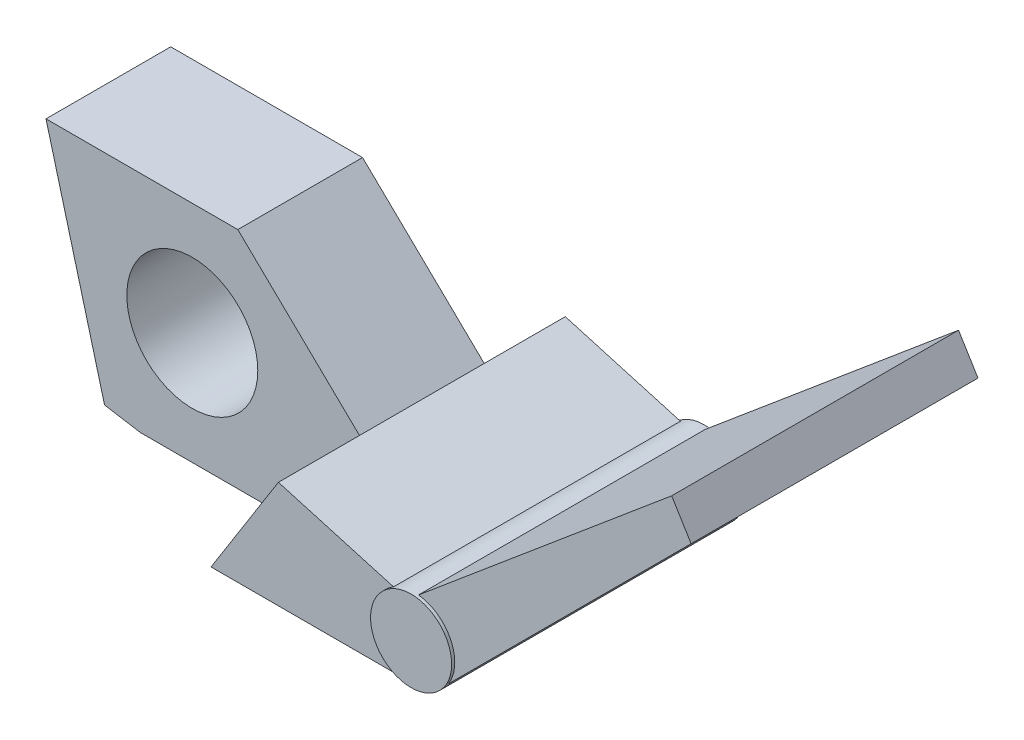
ISO-10303-21;
HEADER;
FILE_DESCRIPTION(('STEP AP214'),'2;1');
FILE_NAME('part.step','',(''),(''),'','','');
FILE_SCHEMA(('AUTOMOTIVE_DESIGN { 1 0 10303 214 1 1 1 1 }'));
ENDSEC;
DATA;
#1=APPLICATION_CONTEXT('core data for automotive mechanical design processes');
#2=APPLICATION_PROTOCOL_DEFINITION('international standard','automotive_design',2000,#1);
#3=PRODUCT_CONTEXT('',#1,'mechanical');
#4=PRODUCT('Part','Part','',(#3));
#5=PRODUCT_RELATED_PRODUCT_CATEGORY('part','',(#4));
#6=PRODUCT_DEFINITION_FORMATION('','',#4);
#7=PRODUCT_DEFINITION_CONTEXT('part definition',#1,'design');
#8=PRODUCT_DEFINITION('design','',#6,#7);
#9=PRODUCT_DEFINITION_SHAPE('','',#8);
#10=(LENGTH_UNIT() NAMED_UNIT(*) SI_UNIT(.MILLI.,.METRE.));
#11=(NAMED_UNIT(*) PLANE_ANGLE_UNIT() SI_UNIT($,.RADIAN.));
#12=(NAMED_UNIT(*) SI_UNIT($,.STERADIAN.) SOLID_ANGLE_UNIT());
#13=UNCERTAINTY_MEASURE_WITH_UNIT(LENGTH_MEASURE(1.E-05),#10,'distance_accuracy_value','');
#14=(GEOMETRIC_REPRESENTATION_CONTEXT(3) GLOBAL_UNCERTAINTY_ASSIGNED_CONTEXT((#13)) GLOBAL_UNIT_ASSIGNED_CONTEXT((#10,
#11,#12)) REPRESENTATION_CONTEXT('',''));
#15=CARTESIAN_POINT('',(0.,0.,0.));
#16=DIRECTION('',(0.,0.,1.));
#17=DIRECTION('',(1.,0.,0.));
#18=AXIS2_PLACEMENT_3D('',#15,#16,#17);
#19=CARTESIAN_POINT('',(0.,9.,5.));
#20=DIRECTION('',(0.,1.,0.));
#21=DIRECTION('',(0.,0.,1.));
#22=AXIS2_PLACEMENT_3D('',#19,#20,#21);
#23=PLANE('',#22);
#24=DIRECTION('',(1.,0.,0.));
#25=VECTOR('',#24,1.);
#26=CARTESIAN_POINT('',(0.,9.,-5.));
#27=LINE('',#26,#25);
#28=CARTESIAN_POINT('',(-11.7290283555708,9.,-5.));
#29=VERTEX_POINT('',#28);
#30=CARTESIAN_POINT('',(3.65,9.,-5.));
#31=VERTEX_POINT('',#30);
#32=EDGE_CURVE('E251',#29,#31,#27,.T.);
#33=ORIENTED_EDGE('',*,*,#32,.F.);
#34=DIRECTION('',(0.,0.,-1.));
#35=VECTOR('',#34,1.);
#36=CARTESIAN_POINT('',(-11.7290283555708,9.,5.));
#37=LINE('',#36,#35);
#38=CARTESIAN_POINT('',(-11.7290283555708,9.,5.));
#39=VERTEX_POINT('',#38);
#40=EDGE_CURVE('E144',#39,#29,#37,.T.);
#41=ORIENTED_EDGE('',*,*,#40,.F.);
#42=DIRECTION('',(1.,0.,0.));
#43=VECTOR('',#42,1.);
#44=CARTESIAN_POINT('',(0.,9.,5.));
#45=LINE('',#44,#43);
#46=CARTESIAN_POINT('',(3.65,9.,5.));
#47=VERTEX_POINT('',#46);
#48=EDGE_CURVE('E153',#39,#47,#45,.T.);
#49=ORIENTED_EDGE('',*,*,#48,.T.);
#50=DIRECTION('',(0.,0.,-1.));
#51=VECTOR('',#50,1.);
#52=CARTESIAN_POINT('',(3.65,9.,5.));
#53=LINE('',#52,#51);
#54=EDGE_CURVE('E42',#47,#31,#53,.T.);
#55=ORIENTED_EDGE('',*,*,#54,.T.);
#56=EDGE_LOOP('',(#33,#41,#49,#55));
#57=FACE_BOUND('',#56,.T.);
#58=ADVANCED_FACE('F34',(#57),#23,.T.);
#59=CARTESIAN_POINT('',(0.,-9.,5.));
#60=DIRECTION('',(0.,1.,0.));
#61=DIRECTION('',(0.,0.,1.));
#62=AXIS2_PLACEMENT_3D('',#59,#60,#61);
#63=PLANE('',#62);
#64=DIRECTION('',(1.,0.,0.));
#65=VECTOR('',#64,1.);
#66=CARTESIAN_POINT('',(0.,-9.,5.));
#67=LINE('',#66,#65);
#68=CARTESIAN_POINT('',(-4.17691453623992,-9.,5.));
#69=VERTEX_POINT('',#68);
#70=CARTESIAN_POINT('',(8.,-9.,5.));
#71=VERTEX_POINT('',#70);
#72=EDGE_CURVE('E241',#69,#71,#67,.T.);
#73=ORIENTED_EDGE('',*,*,#72,.F.);
#74=DIRECTION('',(0.,0.,-1.));
#75=VECTOR('',#74,1.);
#76=CARTESIAN_POINT('',(-4.17691453623992,-9.,5.));
#77=LINE('',#76,#75);
#78=CARTESIAN_POINT('',(-4.17691453623992,-9.,-5.));
#79=VERTEX_POINT('',#78);
#80=EDGE_CURVE('E159',#69,#79,#77,.T.);
#81=ORIENTED_EDGE('',*,*,#80,.T.);
#82=DIRECTION('',(1.,0.,0.));
#83=VECTOR('',#82,1.);
#84=CARTESIAN_POINT('',(0.,-9.,-5.));
#85=LINE('',#84,#83);
#86=CARTESIAN_POINT('',(8.,-9.,-5.));
#87=VERTEX_POINT('',#86);
#88=EDGE_CURVE('E254',#79,#87,#85,.T.);
#89=ORIENTED_EDGE('',*,*,#88,.T.);
#90=DIRECTION('',(0.,0.,-1.));
#91=VECTOR('',#90,1.);
#92=CARTESIAN_POINT('',(8.,-9.,11.5));
#93=LINE('',#92,#91);
#94=CARTESIAN_POINT('',(8.,-9.,-11.5));
#95=VERTEX_POINT('',#94);
#96=EDGE_CURVE('E224',#87,#95,#93,.T.);
#97=ORIENTED_EDGE('',*,*,#96,.T.);
#98=DIRECTION('',(1.,0.,0.));
#99=VECTOR('',#98,1.);
#100=CARTESIAN_POINT('',(0.,-9.,-11.5));
#101=LINE('',#100,#99);
#102=CARTESIAN_POINT('',(23.45,-9.,-11.5));
#103=VERTEX_POINT('',#102);
#104=EDGE_CURVE('E204',#95,#103,#101,.T.);
#105=ORIENTED_EDGE('',*,*,#104,.T.);
#106=DIRECTION('',(0.,0.,-1.));
#107=VECTOR('',#106,1.);
#108=CARTESIAN_POINT('',(23.45,-9.,11.5));
#109=LINE('',#108,#107);
#110=CARTESIAN_POINT('',(23.45,-9.,11.5));
#111=VERTEX_POINT('',#110);
#112=EDGE_CURVE('E212',#111,#103,#109,.T.);
#113=ORIENTED_EDGE('',*,*,#112,.F.);
#114=DIRECTION('',(1.,0.,0.));
#115=VECTOR('',#114,1.);
#116=CARTESIAN_POINT('',(0.,-9.,11.5));
#117=LINE('',#116,#115);
#118=CARTESIAN_POINT('',(8.,-9.,11.5));
#119=VERTEX_POINT('',#118);
#120=EDGE_CURVE('E209',#119,#111,#117,.T.);
#121=ORIENTED_EDGE('',*,*,#120,.F.);
#122=EDGE_CURVE('E225',#119,#71,#93,.T.);
#123=ORIENTED_EDGE('',*,*,#122,.T.);
#124=EDGE_LOOP('',(#73,#81,#89,#97,#105,#113,#121,#123));
#125=FACE_BOUND('',#124,.T.);
#126=ADVANCED_FACE('F290',(#125),#63,.F.);
#127=CARTESIAN_POINT('',(0.,0.,5.));
#128=DIRECTION('',(0.,0.,-1.));
#129=DIRECTION('',(-1.,0.,0.));
#130=AXIS2_PLACEMENT_3D('',#127,#128,#129);
#131=CYLINDRICAL_SURFACE('',#130,5.25);
#132=CARTESIAN_POINT('',(0.,0.,5.));
#133=DIRECTION('',(0.,0.,1.));
#134=DIRECTION('',(1.,0.,0.));
#135=AXIS2_PLACEMENT_3D('',#132,#133,#134);
#136=CIRCLE('',#135,5.25);
#137=CARTESIAN_POINT('',(5.25,0.,5.));
#138=VERTEX_POINT('',#137);
#139=EDGE_CURVE('E236',#138,#138,#136,.T.);
#140=ORIENTED_EDGE('',*,*,#139,.T.);
#141=EDGE_LOOP('',(#140));
#142=FACE_BOUND('',#141,.T.);
#143=CARTESIAN_POINT('',(0.,0.,-5.));
#144=DIRECTION('',(0.,0.,1.));
#145=DIRECTION('',(1.,0.,0.));
#146=AXIS2_PLACEMENT_3D('',#143,#144,#145);
#147=CIRCLE('',#146,5.25);
#148=CARTESIAN_POINT('',(5.25,0.,-5.));
#149=VERTEX_POINT('',#148);
#150=EDGE_CURVE('E235',#149,#149,#147,.T.);
#151=ORIENTED_EDGE('',*,*,#150,.F.);
#152=EDGE_LOOP('',(#151));
#153=FACE_BOUND('',#152,.T.);
#154=ADVANCED_FACE('F36',(#142,#153),#131,.F.);
#155=CARTESIAN_POINT('',(6.25856714010387,6.48093599447109,5.));
#156=DIRECTION('',(0.694658370458998,0.71933980033865,0.));
#157=DIRECTION('',(-0.71933980033865,0.694658370458998,0.));
#158=AXIS2_PLACEMENT_3D('',#155,#156,#157);
#159=PLANE('',#158);
#160=DIRECTION('',(0.71933980033865,-0.694658370458998,0.));
#161=VECTOR('',#160,1.);
#162=CARTESIAN_POINT('',(6.25856714010387,6.48093599447109,-5.));
#163=LINE('',#162,#161);
#164=CARTESIAN_POINT('',(13.4042476925921,-0.419567503424018,-5.));
#165=VERTEX_POINT('',#164);
#166=EDGE_CURVE('E239',#31,#165,#163,.T.);
#167=ORIENTED_EDGE('',*,*,#166,.F.);
#168=ORIENTED_EDGE('',*,*,#54,.F.);
#169=DIRECTION('',(0.71933980033865,-0.694658370458998,0.));
#170=VECTOR('',#169,1.);
#171=CARTESIAN_POINT('',(6.25856714010387,6.48093599447109,5.));
#172=LINE('',#171,#170);
#173=CARTESIAN_POINT('',(13.4042476925921,-0.419567503424018,5.));
#174=VERTEX_POINT('',#173);
#175=EDGE_CURVE('E246',#47,#174,#172,.T.);
#176=ORIENTED_EDGE('',*,*,#175,.T.);
#177=DIRECTION('',(0.,0.,-1.));
#178=VECTOR('',#177,1.);
#179=CARTESIAN_POINT('',(13.4042476925921,-0.419567503424018,5.));
#180=LINE('',#179,#178);
#181=EDGE_CURVE('E11',#174,#165,#180,.T.);
#182=ORIENTED_EDGE('',*,*,#181,.T.);
#183=EDGE_LOOP('',(#167,#168,#176,#182));
#184=FACE_BOUND('',#183,.T.);
#185=ADVANCED_FACE('F266',(#184),#159,.T.);
#186=CARTESIAN_POINT('',(0.,0.,5.));
#187=DIRECTION('',(0.,0.,1.));
#188=DIRECTION('',(1.,0.,0.));
#189=AXIS2_PLACEMENT_3D('',#186,#187,#188);
#190=PLANE('',#189);
#191=ORIENTED_EDGE('',*,*,#48,.F.);
#192=DIRECTION('',(-0.258819045102514,0.96592582628907,0.));
#193=VECTOR('',#192,1.);
#194=CARTESIAN_POINT('',(-11.7290283555708,9.,5.));
#195=LINE('',#194,#193);
#196=CARTESIAN_POINT('',(-7.03385588152449,-8.52262222344006,5.));
#197=VERTEX_POINT('',#196);
#198=EDGE_CURVE('E137',#197,#39,#195,.T.);
#199=ORIENTED_EDGE('',*,*,#198,.F.);
#200=DIRECTION('',(-0.986325487801991,0.164809077760192,0.));
#201=VECTOR('',#200,1.);
#202=CARTESIAN_POINT('',(-7.03385588152449,-8.52262222344006,5.));
#203=LINE('',#202,#201);
#204=EDGE_CURVE('E150',#69,#197,#203,.T.);
#205=ORIENTED_EDGE('',*,*,#204,.F.);
#206=ORIENTED_EDGE('',*,*,#72,.T.);
#207=DIRECTION('',(-0.532937069906378,-0.846154879156059,0.));
#208=VECTOR('',#207,1.);
#209=CARTESIAN_POINT('',(9.78635035401657,-6.16377570019889,5.));
#210=LINE('',#209,#208);
#211=EDGE_CURVE('E243',#174,#71,#210,.T.);
#212=ORIENTED_EDGE('',*,*,#211,.F.);
#213=ORIENTED_EDGE('',*,*,#175,.F.);
#214=EDGE_LOOP('',(#191,#199,#205,#206,#212,#213));
#215=FACE_BOUND('',#214,.T.);
#216=ORIENTED_EDGE('',*,*,#139,.F.);
#217=EDGE_LOOP('',(#216));
#218=FACE_BOUND('',#217,.T.);
#219=ADVANCED_FACE('F148',(#215,#218),#190,.T.);
#220=CARTESIAN_POINT('',(0.,0.,-5.));
#221=DIRECTION('',(0.,0.,1.));
#222=DIRECTION('',(1.,0.,0.));
#223=AXIS2_PLACEMENT_3D('',#220,#221,#222);
#224=PLANE('',#223);
#225=ORIENTED_EDGE('',*,*,#150,.T.);
#226=EDGE_LOOP('',(#225));
#227=FACE_BOUND('',#226,.T.);
#228=ORIENTED_EDGE('',*,*,#88,.F.);
#229=DIRECTION('',(-0.986325487801991,0.164809077760192,0.));
#230=VECTOR('',#229,1.);
#231=CARTESIAN_POINT('',(-7.03385588152449,-8.52262222344006,-5.));
#232=LINE('',#231,#230);
#233=CARTESIAN_POINT('',(-7.03385588152449,-8.52262222344006,-5.));
#234=VERTEX_POINT('',#233);
#235=EDGE_CURVE('E161',#79,#234,#232,.T.);
#236=ORIENTED_EDGE('',*,*,#235,.T.);
#237=DIRECTION('',(-0.258819045102514,0.96592582628907,0.));
#238=VECTOR('',#237,1.);
#239=CARTESIAN_POINT('',(-11.7290283555708,9.,-5.));
#240=LINE('',#239,#238);
#241=EDGE_CURVE('E139',#234,#29,#240,.T.);
#242=ORIENTED_EDGE('',*,*,#241,.T.);
#243=ORIENTED_EDGE('',*,*,#32,.T.);
#244=ORIENTED_EDGE('',*,*,#166,.T.);
#245=DIRECTION('',(-0.532937069906378,-0.846154879156059,0.));
#246=VECTOR('',#245,1.);
#247=CARTESIAN_POINT('',(9.78635035401657,-6.16377570019889,-5.));
#248=LINE('',#247,#246);
#249=EDGE_CURVE('E256',#165,#87,#248,.T.);
#250=ORIENTED_EDGE('',*,*,#249,.T.);
#251=EDGE_LOOP('',(#228,#236,#242,#243,#244,#250));
#252=FACE_BOUND('',#251,.T.);
#253=ADVANCED_FACE('F264',(#227,#252),#224,.F.);
#254=CARTESIAN_POINT('',(9.78635035401657,-6.16377570019889,11.5));
#255=DIRECTION('',(0.846154879156059,-0.532937069906378,0.));
#256=DIRECTION('',(0.532937069906378,0.846154879156059,0.));
#257=AXIS2_PLACEMENT_3D('',#254,#255,#256);
#258=PLANE('',#257);
#259=DIRECTION('',(0.,0.,-1.));
#260=VECTOR('',#259,1.);
#261=CARTESIAN_POINT('',(13.4042476925921,-0.419567503424018,11.5));
#262=LINE('',#261,#260);
#263=CARTESIAN_POINT('',(13.4042476925921,-0.419567503424018,11.5));
#264=VERTEX_POINT('',#263);
#265=EDGE_CURVE('E229',#264,#174,#262,.T.);
#266=ORIENTED_EDGE('',*,*,#265,.T.);
#267=ORIENTED_EDGE('',*,*,#211,.T.);
#268=ORIENTED_EDGE('',*,*,#122,.F.);
#269=DIRECTION('',(-0.532937069906378,-0.846154879156059,0.));
#270=VECTOR('',#269,1.);
#271=CARTESIAN_POINT('',(9.78635035401657,-6.16377570019889,11.5));
#272=LINE('',#271,#270);
#273=EDGE_CURVE('E207',#264,#119,#272,.T.);
#274=ORIENTED_EDGE('',*,*,#273,.F.);
#275=EDGE_LOOP('',(#266,#267,#268,#274));
#276=FACE_BOUND('',#275,.T.);
#277=ADVANCED_FACE('F274',(#276),#258,.F.);
#278=CARTESIAN_POINT('',(0.907232026884793,3.16389407447309,11.5));
#279=DIRECTION('',(0.275637355816999,0.961261695938319,0.));
#280=DIRECTION('',(-0.961261695938319,0.275637355816999,0.));
#281=AXIS2_PLACEMENT_3D('',#278,#279,#280);
#282=PLANE('',#281);
#283=DIRECTION('',(0.961261695938319,-0.275637355816999,0.));
#284=VECTOR('',#283,1.);
#285=CARTESIAN_POINT('',(0.907232026884793,3.16389407447309,-11.5));
#286=LINE('',#285,#284);
#287=CARTESIAN_POINT('',(13.4042476925921,-0.419567503424018,-11.5));
#288=VERTEX_POINT('',#287);
#289=CARTESIAN_POINT('',(22.6342476925921,-3.06622741397782,-11.5));
#290=VERTEX_POINT('',#289);
#291=EDGE_CURVE('E215',#288,#290,#286,.T.);
#292=ORIENTED_EDGE('',*,*,#291,.F.);
#293=EDGE_CURVE('E228',#165,#288,#262,.T.);
#294=ORIENTED_EDGE('',*,*,#293,.F.);
#295=ORIENTED_EDGE('',*,*,#181,.F.);
#296=ORIENTED_EDGE('',*,*,#265,.F.);
#297=DIRECTION('',(0.961261695938319,-0.275637355816999,0.));
#298=VECTOR('',#297,1.);
#299=CARTESIAN_POINT('',(0.907232026884793,3.16389407447309,11.5));
#300=LINE('',#299,#298);
#301=CARTESIAN_POINT('',(22.6342476925921,-3.06622741397782,11.5));
#302=VERTEX_POINT('',#301);
#303=EDGE_CURVE('E203',#264,#302,#300,.T.);
#304=ORIENTED_EDGE('',*,*,#303,.T.);
#305=DIRECTION('',(0.,0.,-1.));
#306=VECTOR('',#305,1.);
#307=CARTESIAN_POINT('',(22.6342476925921,-3.06622741397782,11.5));
#308=LINE('',#307,#306);
#309=EDGE_CURVE('E232',#302,#290,#308,.T.);
#310=ORIENTED_EDGE('',*,*,#309,.T.);
#311=EDGE_LOOP('',(#292,#294,#295,#296,#304,#310));
#312=FACE_BOUND('',#311,.T.);
#313=ADVANCED_FACE('F271',(#312),#282,.T.);
#314=ORIENTED_EDGE('',*,*,#249,.F.);
#315=ORIENTED_EDGE('',*,*,#293,.T.);
#316=DIRECTION('',(-0.532937069906378,-0.846154879156059,0.));
#317=VECTOR('',#316,1.);
#318=CARTESIAN_POINT('',(9.78635035401657,-6.16377570019889,-11.5));
#319=LINE('',#318,#317);
#320=EDGE_CURVE('E218',#288,#95,#319,.T.);
#321=ORIENTED_EDGE('',*,*,#320,.T.);
#322=ORIENTED_EDGE('',*,*,#96,.F.);
#323=EDGE_LOOP('',(#314,#315,#321,#322));
#324=FACE_BOUND('',#323,.T.);
#325=ADVANCED_FACE('F288',(#324),#258,.F.);
#326=CARTESIAN_POINT('',(0.,0.,11.5));
#327=DIRECTION('',(0.,0.,1.));
#328=DIRECTION('',(1.,0.,0.));
#329=AXIS2_PLACEMENT_3D('',#326,#327,#328);
#330=PLANE('',#329);
#331=CARTESIAN_POINT('',(24.2927879127426,-5.86117720568125,11.5));
#332=DIRECTION('',(0.,0.,1.));
#333=DIRECTION('',(1.,0.,0.));
#334=AXIS2_PLACEMENT_3D('',#331,#332,#333);
#335=CIRCLE('',#334,3.25);
#336=EDGE_CURVE('E201',#302,#111,#335,.T.);
#337=ORIENTED_EDGE('',*,*,#336,.F.);
#338=ORIENTED_EDGE('',*,*,#303,.F.);
#339=ORIENTED_EDGE('',*,*,#273,.T.);
#340=ORIENTED_EDGE('',*,*,#120,.T.);
#341=EDGE_LOOP('',(#337,#338,#339,#340));
#342=FACE_BOUND('',#341,.T.);
#343=ADVANCED_FACE('F280',(#342),#330,.T.);
#344=CARTESIAN_POINT('',(0.,0.,-11.5));
#345=DIRECTION('',(0.,0.,1.));
#346=DIRECTION('',(1.,0.,0.));
#347=AXIS2_PLACEMENT_3D('',#344,#345,#346);
#348=PLANE('',#347);
#349=CARTESIAN_POINT('',(24.2927879127426,-5.86117720568125,-11.5));
#350=DIRECTION('',(0.,0.,1.));
#351=DIRECTION('',(1.,0.,0.));
#352=AXIS2_PLACEMENT_3D('',#349,#350,#351);
#353=CIRCLE('',#352,3.25);
#354=EDGE_CURVE('E198',#290,#103,#353,.T.);
#355=ORIENTED_EDGE('',*,*,#354,.T.);
#356=ORIENTED_EDGE('',*,*,#104,.F.);
#357=ORIENTED_EDGE('',*,*,#320,.F.);
#358=ORIENTED_EDGE('',*,*,#291,.T.);
#359=EDGE_LOOP('',(#355,#356,#357,#358));
#360=FACE_BOUND('',#359,.T.);
#361=ADVANCED_FACE('F284',(#360),#348,.F.);
#362=CARTESIAN_POINT('',(24.2927879127426,-5.86117720568125,11.75));
#363=DIRECTION('',(0.,0.,-1.));
#364=DIRECTION('',(-1.,0.,0.));
#365=AXIS2_PLACEMENT_3D('',#362,#363,#364);
#366=CYLINDRICAL_SURFACE('',#365,3.25);
#367=DIRECTION('',(0.,0.,-1.));
#368=VECTOR('',#367,1.);
#369=CARTESIAN_POINT('',(27.0470999389281,-7.5863627790067,11.5));
#370=LINE('',#369,#368);
#371=CARTESIAN_POINT('',(27.0470999389281,-7.58636277900669,11.5));
#372=VERTEX_POINT('',#371);
#373=CARTESIAN_POINT('',(27.0470999389281,-7.58636277900671,-11.5));
#374=VERTEX_POINT('',#373);
#375=EDGE_CURVE('E49',#372,#374,#370,.T.);
#376=ORIENTED_EDGE('',*,*,#375,.F.);
#377=CARTESIAN_POINT('',(24.2927879127426,-5.86117720568125,11.5));
#378=DIRECTION('',(0.,0.,1.));
#379=DIRECTION('',(1.,0.,0.));
#380=AXIS2_PLACEMENT_3D('',#377,#378,#379);
#381=CIRCLE('',#380,3.25);
#382=CARTESIAN_POINT('',(24.6324818691016,-2.62897857069404,11.5));
#383=VERTEX_POINT('',#382);
#384=EDGE_CURVE('E54',#372,#383,#381,.T.);
#385=ORIENTED_EDGE('',*,*,#384,.T.);
#386=DIRECTION('',(0.,0.,-1.));
#387=VECTOR('',#386,1.);
#388=CARTESIAN_POINT('',(24.6324818691016,-2.62897857069404,11.5));
#389=LINE('',#388,#387);
#390=CARTESIAN_POINT('',(24.6324818691016,-2.62897857069404,-11.5));
#391=VERTEX_POINT('',#390);
#392=EDGE_CURVE('E177',#383,#391,#389,.T.);
#393=ORIENTED_EDGE('',*,*,#392,.T.);
#394=CARTESIAN_POINT('',(24.2927879127426,-5.86117720568125,-11.5));
#395=DIRECTION('',(0.,0.,1.));
#396=DIRECTION('',(1.,0.,0.));
#397=AXIS2_PLACEMENT_3D('',#394,#395,#396);
#398=CIRCLE('',#397,3.25);
#399=EDGE_CURVE('E167',#374,#391,#398,.T.);
#400=ORIENTED_EDGE('',*,*,#399,.F.);
#401=EDGE_LOOP('',(#376,#385,#393,#400));
#402=FACE_BOUND('',#401,.T.);
#403=ORIENTED_EDGE('',*,*,#336,.T.);
#404=ORIENTED_EDGE('',*,*,#112,.T.);
#405=ORIENTED_EDGE('',*,*,#354,.F.);
#406=ORIENTED_EDGE('',*,*,#309,.F.);
#407=EDGE_LOOP('',(#403,#404,#405,#406));
#408=FACE_BOUND('',#407,.T.);
#409=CARTESIAN_POINT('',(24.2927879127426,-5.86117720568125,11.75));
#410=DIRECTION('',(0.,0.,1.));
#411=DIRECTION('',(1.,0.,0.));
#412=AXIS2_PLACEMENT_3D('',#409,#410,#411);
#413=CIRCLE('',#412,3.25);
#414=CARTESIAN_POINT('',(27.5427879127426,-5.86117720568125,11.75));
#415=VERTEX_POINT('',#414);
#416=EDGE_CURVE('E195',#415,#415,#413,.T.);
#417=ORIENTED_EDGE('',*,*,#416,.F.);
#418=EDGE_LOOP('',(#417));
#419=FACE_BOUND('',#418,.T.);
#420=CARTESIAN_POINT('',(24.2927879127426,-5.86117720568125,-11.75));
#421=DIRECTION('',(0.,0.,1.));
#422=DIRECTION('',(1.,0.,0.));
#423=AXIS2_PLACEMENT_3D('',#420,#421,#422);
#424=CIRCLE('',#423,3.25);
#425=CARTESIAN_POINT('',(27.5427879127426,-5.86117720568125,-11.75));
#426=VERTEX_POINT('',#425);
#427=EDGE_CURVE('E194',#426,#426,#424,.T.);
#428=ORIENTED_EDGE('',*,*,#427,.T.);
#429=EDGE_LOOP('',(#428));
#430=FACE_BOUND('',#429,.T.);
#431=ADVANCED_FACE('F292',(#402,#408,#419,#430),#366,.T.);
#432=CARTESIAN_POINT('',(0.,0.,11.75));
#433=DIRECTION('',(0.,0.,1.));
#434=DIRECTION('',(1.,0.,0.));
#435=AXIS2_PLACEMENT_3D('',#432,#433,#434);
#436=PLANE('',#435);
#437=ORIENTED_EDGE('',*,*,#416,.T.);
#438=EDGE_LOOP('',(#437));
#439=FACE_BOUND('',#438,.T.);
#440=ADVANCED_FACE('F295',(#439),#436,.T.);
#441=CARTESIAN_POINT('',(0.,0.,-11.75));
#442=DIRECTION('',(0.,0.,1.));
#443=DIRECTION('',(1.,0.,0.));
#444=AXIS2_PLACEMENT_3D('',#441,#442,#443);
#445=PLANE('',#444);
#446=ORIENTED_EDGE('',*,*,#427,.F.);
#447=EDGE_LOOP('',(#446));
#448=FACE_BOUND('',#447,.T.);
#449=ADVANCED_FACE('F301',(#448),#445,.F.);
#450=CARTESIAN_POINT('',(17.3167313589674,-17.3167313589674,11.5));
#451=DIRECTION('',(-0.707106781186549,0.707106781186546,0.));
#452=DIRECTION('',(-0.707106781186546,-0.707106781186549,0.));
#453=AXIS2_PLACEMENT_3D('',#450,#451,#452);
#454=PLANE('',#453);
#455=DIRECTION('',(0.707106781186546,0.707106781186549,0.));
#456=VECTOR('',#455,1.);
#457=CARTESIAN_POINT('',(17.3167313589674,-17.3167313589674,-11.5));
#458=LINE('',#457,#456);
#459=CARTESIAN_POINT('',(46.4925364215581,11.8590737036234,-11.5));
#460=VERTEX_POINT('',#459);
#461=EDGE_CURVE('E180',#374,#460,#458,.T.);
#462=ORIENTED_EDGE('',*,*,#461,.T.);
#463=DIRECTION('',(0.,0.,-1.));
#464=VECTOR('',#463,1.);
#465=CARTESIAN_POINT('',(46.4925364215581,11.8590737036234,11.5));
#466=LINE('',#465,#464);
#467=CARTESIAN_POINT('',(46.4925364215581,11.8590737036234,11.5));
#468=VERTEX_POINT('',#467);
#469=EDGE_CURVE('E190',#468,#460,#466,.T.);
#470=ORIENTED_EDGE('',*,*,#469,.F.);
#471=DIRECTION('',(0.707106781186546,0.707106781186549,0.));
#472=VECTOR('',#471,1.);
#473=CARTESIAN_POINT('',(17.3167313589674,-17.3167313589674,11.5));
#474=LINE('',#473,#472);
#475=EDGE_CURVE('E169',#372,#468,#474,.T.);
#476=ORIENTED_EDGE('',*,*,#475,.F.);
#477=ORIENTED_EDGE('',*,*,#375,.T.);
#478=EDGE_LOOP('',(#462,#470,#476,#477));
#479=FACE_BOUND('',#478,.T.);
#480=ADVANCED_FACE('F303',(#479),#454,.F.);
#481=CARTESIAN_POINT('',(39.0852016497614,23.9483209539635,11.5));
#482=DIRECTION('',(-0.852670499886993,-0.522449058399443,0.));
#483=DIRECTION('',(0.522449058399443,-0.852670499886993,0.));
#484=AXIS2_PLACEMENT_3D('',#481,#482,#483);
#485=PLANE('',#484);
#486=DIRECTION('',(-0.522449058399443,0.852670499886994,0.));
#487=VECTOR('',#486,1.);
#488=CARTESIAN_POINT('',(39.0852016497614,23.9483209539635,-11.5));
#489=LINE('',#488,#487);
#490=CARTESIAN_POINT('',(44.9326596117545,14.4048930859993,-11.5));
#491=VERTEX_POINT('',#490);
#492=EDGE_CURVE('E182',#460,#491,#489,.T.);
#493=ORIENTED_EDGE('',*,*,#492,.T.);
#494=DIRECTION('',(0.,0.,-1.));
#495=VECTOR('',#494,1.);
#496=CARTESIAN_POINT('',(44.9326596117545,14.4048930859993,11.5));
#497=LINE('',#496,#495);
#498=CARTESIAN_POINT('',(44.9326596117545,14.4048930859993,11.5));
#499=VERTEX_POINT('',#498);
#500=EDGE_CURVE('E188',#499,#491,#497,.T.);
#501=ORIENTED_EDGE('',*,*,#500,.F.);
#502=DIRECTION('',(-0.522449058399443,0.852670499886994,0.));
#503=VECTOR('',#502,1.);
#504=CARTESIAN_POINT('',(39.0852016497614,23.9483209539635,11.5));
#505=LINE('',#504,#503);
#506=EDGE_CURVE('E172',#468,#499,#505,.T.);
#507=ORIENTED_EDGE('',*,*,#506,.F.);
#508=ORIENTED_EDGE('',*,*,#469,.T.);
#509=EDGE_LOOP('',(#493,#501,#507,#508));
#510=FACE_BOUND('',#509,.T.);
#511=ADVANCED_FACE('F309',(#510),#485,.F.);
#512=CARTESIAN_POINT('',(11.4720673800205,-13.6718775146222,11.5));
#513=DIRECTION('',(-0.642787609686541,0.766044443118976,0.));
#514=DIRECTION('',(-0.766044443118977,-0.642787609686541,0.));
#515=AXIS2_PLACEMENT_3D('',#512,#513,#514);
#516=PLANE('',#515);
#517=DIRECTION('',(0.766044443118977,0.642787609686541,0.));
#518=VECTOR('',#517,1.);
#519=CARTESIAN_POINT('',(11.4720673800205,-13.6718775146222,-11.5));
#520=LINE('',#519,#518);
#521=EDGE_CURVE('E170',#391,#491,#520,.T.);
#522=ORIENTED_EDGE('',*,*,#521,.F.);
#523=ORIENTED_EDGE('',*,*,#392,.F.);
#524=DIRECTION('',(0.766044443118977,0.642787609686541,0.));
#525=VECTOR('',#524,1.);
#526=CARTESIAN_POINT('',(11.4720673800205,-13.6718775146222,11.5));
#527=LINE('',#526,#525);
#528=EDGE_CURVE('E174',#383,#499,#527,.T.);
#529=ORIENTED_EDGE('',*,*,#528,.T.);
#530=ORIENTED_EDGE('',*,*,#500,.T.);
#531=EDGE_LOOP('',(#522,#523,#529,#530));
#532=FACE_BOUND('',#531,.T.);
#533=ADVANCED_FACE('F371',(#532),#516,.T.);
#534=CARTESIAN_POINT('',(0.,0.,11.5));
#535=DIRECTION('',(0.,0.,1.));
#536=DIRECTION('',(1.,0.,0.));
#537=AXIS2_PLACEMENT_3D('',#534,#535,#536);
#538=PLANE('',#537);
#539=ORIENTED_EDGE('',*,*,#384,.F.);
#540=ORIENTED_EDGE('',*,*,#475,.T.);
#541=ORIENTED_EDGE('',*,*,#506,.T.);
#542=ORIENTED_EDGE('',*,*,#528,.F.);
#543=EDGE_LOOP('',(#539,#540,#541,#542));
#544=FACE_BOUND('',#543,.T.);
#545=ADVANCED_FACE('F381',(#544),#538,.T.);
#546=CARTESIAN_POINT('',(0.,0.,-11.5));
#547=DIRECTION('',(0.,0.,1.));
#548=DIRECTION('',(1.,0.,0.));
#549=AXIS2_PLACEMENT_3D('',#546,#547,#548);
#550=PLANE('',#549);
#551=ORIENTED_EDGE('',*,*,#399,.T.);
#552=ORIENTED_EDGE('',*,*,#521,.T.);
#553=ORIENTED_EDGE('',*,*,#492,.F.);
#554=ORIENTED_EDGE('',*,*,#461,.F.);
#555=EDGE_LOOP('',(#551,#552,#553,#554));
#556=FACE_BOUND('',#555,.T.);
#557=ADVANCED_FACE('F391',(#556),#550,.F.);
#558=CARTESIAN_POINT('',(-11.7290283555708,9.,5.));
#559=DIRECTION('',(-0.96592582628907,-0.258819045102514,0.));
#560=DIRECTION('',(0.258819045102514,-0.96592582628907,0.));
#561=AXIS2_PLACEMENT_3D('',#558,#559,#560);
#562=PLANE('',#561);
#563=ORIENTED_EDGE('',*,*,#241,.F.);
#564=DIRECTION('',(0.,0.,-1.));
#565=VECTOR('',#564,1.);
#566=CARTESIAN_POINT('',(-7.03385588152449,-8.52262222344006,5.));
#567=LINE('',#566,#565);
#568=EDGE_CURVE('E133',#197,#234,#567,.T.);
#569=ORIENTED_EDGE('',*,*,#568,.F.);
#570=ORIENTED_EDGE('',*,*,#198,.T.);
#571=ORIENTED_EDGE('',*,*,#40,.T.);
#572=EDGE_LOOP('',(#563,#569,#570,#571));
#573=FACE_BOUND('',#572,.T.);
#574=ADVANCED_FACE('F135',(#573),#562,.T.);
#575=CARTESIAN_POINT('',(-7.03385588152449,-8.52262222344006,5.));
#576=DIRECTION('',(-0.164809077760192,-0.986325487801991,0.));
#577=DIRECTION('',(0.986325487801991,-0.164809077760192,0.));
#578=AXIS2_PLACEMENT_3D('',#575,#576,#577);
#579=PLANE('',#578);
#580=ORIENTED_EDGE('',*,*,#235,.F.);
#581=ORIENTED_EDGE('',*,*,#80,.F.);
#582=ORIENTED_EDGE('',*,*,#204,.T.);
#583=ORIENTED_EDGE('',*,*,#568,.T.);
#584=EDGE_LOOP('',(#580,#581,#582,#583));
#585=FACE_BOUND('',#584,.T.);
#586=ADVANCED_FACE('F157',(#585),#579,.T.);
#587=CLOSED_SHELL('',(#58,#126,#154,#185,#219,#253,#277,#313,#325,#343,#361,#431,#440,#449,#480,
#511,#533,#545,#557,#574,#586));
#588=MANIFOLD_SOLID_BREP('B2',#587);
#589=ADVANCED_BREP_SHAPE_REPRESENTATION('',(#18,#588),#14);
#590=SHAPE_DEFINITION_REPRESENTATION(#9,#589);
ENDSEC;
END-ISO-10303-21;
